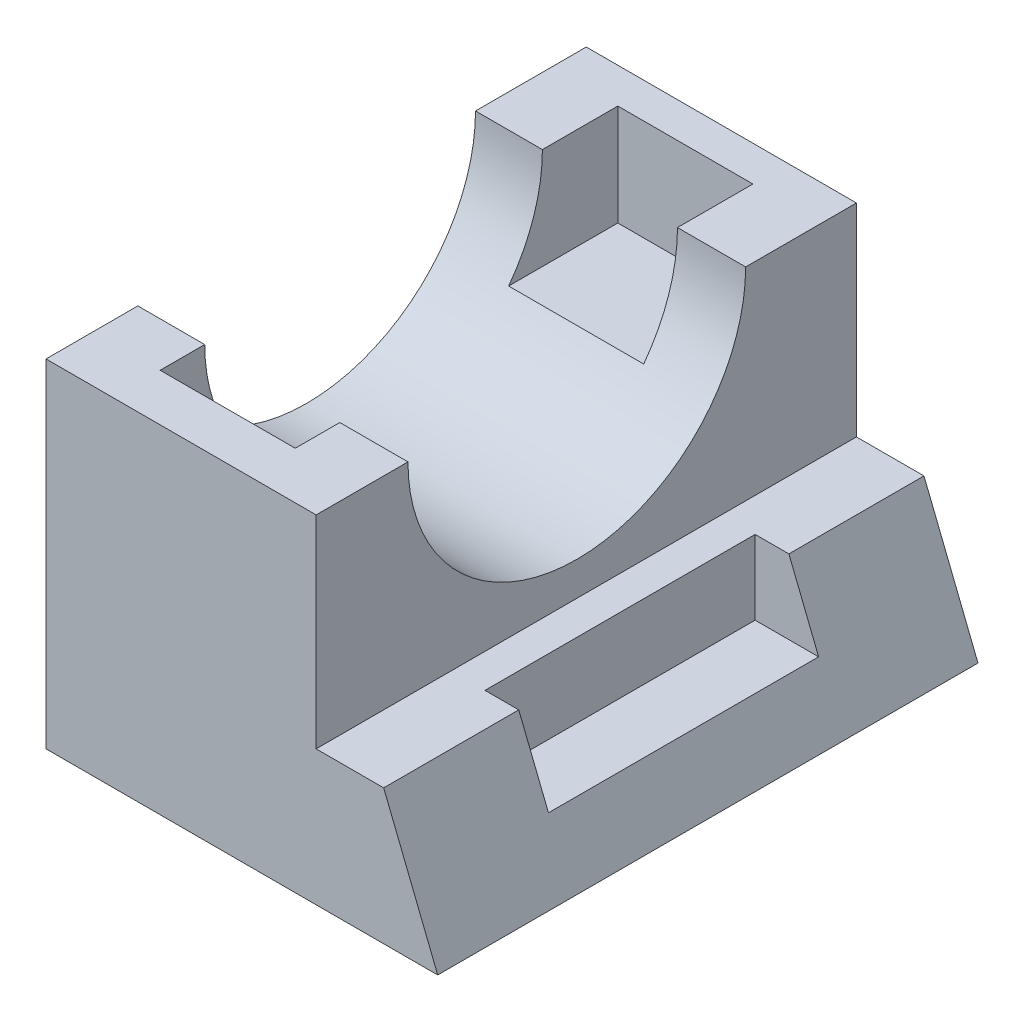
ISO-10303-21;
HEADER;
FILE_DESCRIPTION(('STEP AP214'),'2;1');
FILE_NAME('part.step','',(''),(''),'','','');
FILE_SCHEMA(('AUTOMOTIVE_DESIGN { 1 0 10303 214 1 1 1 1 }'));
ENDSEC;
DATA;
#1=APPLICATION_CONTEXT('core data for automotive mechanical design processes');
#2=APPLICATION_PROTOCOL_DEFINITION('international standard','automotive_design',2000,#1);
#3=PRODUCT_CONTEXT('',#1,'mechanical');
#4=PRODUCT('Part','Part','',(#3));
#5=PRODUCT_RELATED_PRODUCT_CATEGORY('part','',(#4));
#6=PRODUCT_DEFINITION_FORMATION('','',#4);
#7=PRODUCT_DEFINITION_CONTEXT('part definition',#1,'design');
#8=PRODUCT_DEFINITION('design','',#6,#7);
#9=PRODUCT_DEFINITION_SHAPE('','',#8);
#10=(LENGTH_UNIT() NAMED_UNIT(*) SI_UNIT(.MILLI.,.METRE.));
#11=(NAMED_UNIT(*) PLANE_ANGLE_UNIT() SI_UNIT($,.RADIAN.));
#12=(NAMED_UNIT(*) SI_UNIT($,.STERADIAN.) SOLID_ANGLE_UNIT());
#13=UNCERTAINTY_MEASURE_WITH_UNIT(LENGTH_MEASURE(1.E-05),#10,'distance_accuracy_value','');
#14=(GEOMETRIC_REPRESENTATION_CONTEXT(3) GLOBAL_UNCERTAINTY_ASSIGNED_CONTEXT((#13)) GLOBAL_UNIT_ASSIGNED_CONTEXT((#10,
#11,#12)) REPRESENTATION_CONTEXT('',''));
#15=CARTESIAN_POINT('',(0.,0.,0.));
#16=DIRECTION('',(0.,0.,1.));
#17=DIRECTION('',(1.,0.,0.));
#18=AXIS2_PLACEMENT_3D('',#15,#16,#17);
#19=CARTESIAN_POINT('',(40.,50.,80.));
#20=DIRECTION('',(0.,-1.,0.));
#21=DIRECTION('',(0.,0.,-1.));
#22=AXIS2_PLACEMENT_3D('',#19,#20,#21);
#23=PLANE('',#22);
#24=DIRECTION('',(-1.,0.,0.));
#25=VECTOR('',#24,1.);
#26=CARTESIAN_POINT('',(80.,50.,66.4026369118836));
#27=LINE('',#26,#25);
#28=CARTESIAN_POINT('',(40.,50.,66.4026369118836));
#29=VERTEX_POINT('',#28);
#30=CARTESIAN_POINT('',(29.9052649770799,50.,66.4026369118836));
#31=VERTEX_POINT('',#30);
#32=EDGE_CURVE('E272',#29,#31,#27,.T.);
#33=ORIENTED_EDGE('',*,*,#32,.T.);
#34=DIRECTION('',(0.,0.,-1.));
#35=VECTOR('',#34,1.);
#36=CARTESIAN_POINT('',(29.9052649770799,50.,5.23445028715975));
#37=LINE('',#36,#35);
#38=CARTESIAN_POINT('',(29.9052649770799,50.,73.));
#39=VERTEX_POINT('',#38);
#40=EDGE_CURVE('E233',#39,#31,#37,.T.);
#41=ORIENTED_EDGE('',*,*,#40,.F.);
#42=DIRECTION('',(1.,0.,0.));
#43=VECTOR('',#42,1.);
#44=CARTESIAN_POINT('',(29.9052649770799,50.,73.));
#45=LINE('',#44,#43);
#46=CARTESIAN_POINT('',(9.90526497707994,50.,73.));
#47=VERTEX_POINT('',#46);
#48=EDGE_CURVE('E244',#47,#39,#45,.T.);
#49=ORIENTED_EDGE('',*,*,#48,.F.);
#50=DIRECTION('',(0.,0.,1.));
#51=VECTOR('',#50,1.);
#52=CARTESIAN_POINT('',(9.90526497707993,50.,5.23445028715976));
#53=LINE('',#52,#51);
#54=CARTESIAN_POINT('',(9.90526497707994,50.,66.4026369118836));
#55=VERTEX_POINT('',#54);
#56=EDGE_CURVE('E240',#55,#47,#53,.T.);
#57=ORIENTED_EDGE('',*,*,#56,.F.);
#58=CARTESIAN_POINT('',(0.,50.,66.4026369118836));
#59=VERTEX_POINT('',#58);
#60=EDGE_CURVE('E265',#55,#59,#27,.T.);
#61=ORIENTED_EDGE('',*,*,#60,.T.);
#62=DIRECTION('',(0.,0.,-1.));
#63=VECTOR('',#62,1.);
#64=CARTESIAN_POINT('',(0.,50.,80.));
#65=LINE('',#64,#63);
#66=CARTESIAN_POINT('',(0.,50.,80.));
#67=VERTEX_POINT('',#66);
#68=EDGE_CURVE('E338',#67,#59,#65,.T.);
#69=ORIENTED_EDGE('',*,*,#68,.F.);
#70=DIRECTION('',(-1.,0.,0.));
#71=VECTOR('',#70,1.);
#72=CARTESIAN_POINT('',(40.,50.,80.));
#73=LINE('',#72,#71);
#74=CARTESIAN_POINT('',(40.,50.,80.));
#75=VERTEX_POINT('',#74);
#76=EDGE_CURVE('E276',#75,#67,#73,.T.);
#77=ORIENTED_EDGE('',*,*,#76,.F.);
#78=DIRECTION('',(0.,0.,-1.));
#79=VECTOR('',#78,1.);
#80=CARTESIAN_POINT('',(40.,50.,80.));
#81=LINE('',#80,#79);
#82=EDGE_CURVE('E316',#75,#29,#81,.T.);
#83=ORIENTED_EDGE('',*,*,#82,.T.);
#84=EDGE_LOOP('',(#33,#41,#49,#57,#61,#69,#77,#83));
#85=FACE_BOUND('',#84,.T.);
#86=ADVANCED_FACE('F39',(#85),#23,.F.);
#87=DIRECTION('',(-1.,0.,0.));
#88=VECTOR('',#87,1.);
#89=CARTESIAN_POINT('',(29.9052649770799,50.,5.23445028715975));
#90=LINE('',#89,#88);
#91=CARTESIAN_POINT('',(29.9052649770799,50.,5.23445028715975));
#92=VERTEX_POINT('',#91);
#93=CARTESIAN_POINT('',(9.90526497707993,50.,5.23445028715976));
#94=VERTEX_POINT('',#93);
#95=EDGE_CURVE('E236',#92,#94,#90,.T.);
#96=ORIENTED_EDGE('',*,*,#95,.F.);
#97=CARTESIAN_POINT('',(29.9052649770799,50.,16.4026369118836));
#98=VERTEX_POINT('',#97);
#99=EDGE_CURVE('E217',#98,#92,#37,.T.);
#100=ORIENTED_EDGE('',*,*,#99,.F.);
#101=DIRECTION('',(-1.,0.,0.));
#102=VECTOR('',#101,1.);
#103=CARTESIAN_POINT('',(80.,50.,16.4026369118836));
#104=LINE('',#103,#102);
#105=CARTESIAN_POINT('',(40.,50.,16.4026369118836));
#106=VERTEX_POINT('',#105);
#107=EDGE_CURVE('E266',#106,#98,#104,.T.);
#108=ORIENTED_EDGE('',*,*,#107,.F.);
#109=CARTESIAN_POINT('',(40.,50.,0.));
#110=VERTEX_POINT('',#109);
#111=EDGE_CURVE('E296',#106,#110,#81,.T.);
#112=ORIENTED_EDGE('',*,*,#111,.T.);
#113=DIRECTION('',(-1.,0.,0.));
#114=VECTOR('',#113,1.);
#115=CARTESIAN_POINT('',(40.,50.,0.));
#116=LINE('',#115,#114);
#117=CARTESIAN_POINT('',(0.,50.,0.));
#118=VERTEX_POINT('',#117);
#119=EDGE_CURVE('E270',#110,#118,#116,.T.);
#120=ORIENTED_EDGE('',*,*,#119,.T.);
#121=CARTESIAN_POINT('',(0.,50.,16.4026369118836));
#122=VERTEX_POINT('',#121);
#123=EDGE_CURVE('E337',#122,#118,#65,.T.);
#124=ORIENTED_EDGE('',*,*,#123,.F.);
#125=CARTESIAN_POINT('',(9.90526497707993,50.,16.4026369118836));
#126=VERTEX_POINT('',#125);
#127=EDGE_CURVE('E271',#126,#122,#104,.T.);
#128=ORIENTED_EDGE('',*,*,#127,.F.);
#129=EDGE_CURVE('E241',#94,#126,#53,.T.);
#130=ORIENTED_EDGE('',*,*,#129,.F.);
#131=EDGE_LOOP('',(#96,#100,#108,#112,#120,#124,#128,#130));
#132=FACE_BOUND('',#131,.T.);
#133=ADVANCED_FACE('F41',(#132),#23,.F.);
#134=CARTESIAN_POINT('',(0.,50.,80.));
#135=DIRECTION('',(1.,0.,0.));
#136=DIRECTION('',(0.,0.,-1.));
#137=AXIS2_PLACEMENT_3D('',#134,#135,#136);
#138=PLANE('',#137);
#139=ORIENTED_EDGE('',*,*,#68,.T.);
#140=CARTESIAN_POINT('',(0.,50.,41.4026369118836));
#141=DIRECTION('',(-1.,0.,0.));
#142=DIRECTION('',(0.,0.,-1.));
#143=AXIS2_PLACEMENT_3D('',#140,#141,#142);
#144=CIRCLE('',#143,25.);
#145=EDGE_CURVE('E251',#122,#59,#144,.T.);
#146=ORIENTED_EDGE('',*,*,#145,.F.);
#147=ORIENTED_EDGE('',*,*,#123,.T.);
#148=DIRECTION('',(0.,-1.,0.));
#149=VECTOR('',#148,1.);
#150=CARTESIAN_POINT('',(0.,50.,0.));
#151=LINE('',#150,#149);
#152=CARTESIAN_POINT('',(0.,0.,0.));
#153=VERTEX_POINT('',#152);
#154=EDGE_CURVE('E300',#118,#153,#151,.T.);
#155=ORIENTED_EDGE('',*,*,#154,.T.);
#156=DIRECTION('',(0.,0.,-1.));
#157=VECTOR('',#156,1.);
#158=CARTESIAN_POINT('',(0.,0.,80.));
#159=LINE('',#158,#157);
#160=CARTESIAN_POINT('',(0.,0.,80.));
#161=VERTEX_POINT('',#160);
#162=EDGE_CURVE('E333',#161,#153,#159,.T.);
#163=ORIENTED_EDGE('',*,*,#162,.F.);
#164=DIRECTION('',(0.,-1.,0.));
#165=VECTOR('',#164,1.);
#166=CARTESIAN_POINT('',(0.,50.,80.));
#167=LINE('',#166,#165);
#168=EDGE_CURVE('E280',#67,#161,#167,.T.);
#169=ORIENTED_EDGE('',*,*,#168,.F.);
#170=EDGE_LOOP('',(#139,#146,#147,#155,#163,#169));
#171=FACE_BOUND('',#170,.T.);
#172=ADVANCED_FACE('F415',(#171),#138,.F.);
#173=CARTESIAN_POINT('',(0.,0.,80.));
#174=DIRECTION('',(0.,1.,0.));
#175=DIRECTION('',(0.,0.,1.));
#176=AXIS2_PLACEMENT_3D('',#173,#174,#175);
#177=PLANE('',#176);
#178=DIRECTION('',(1.,0.,0.));
#179=VECTOR('',#178,1.);
#180=CARTESIAN_POINT('',(0.,0.,0.));
#181=LINE('',#180,#179);
#182=CARTESIAN_POINT('',(58.,0.,0.));
#183=VERTEX_POINT('',#182);
#184=EDGE_CURVE('E303',#153,#183,#181,.T.);
#185=ORIENTED_EDGE('',*,*,#184,.T.);
#186=DIRECTION('',(0.,0.,-1.));
#187=VECTOR('',#186,1.);
#188=CARTESIAN_POINT('',(58.,0.,80.));
#189=LINE('',#188,#187);
#190=CARTESIAN_POINT('',(58.,0.,80.));
#191=VERTEX_POINT('',#190);
#192=EDGE_CURVE('E329',#191,#183,#189,.T.);
#193=ORIENTED_EDGE('',*,*,#192,.F.);
#194=DIRECTION('',(1.,0.,0.));
#195=VECTOR('',#194,1.);
#196=CARTESIAN_POINT('',(0.,0.,80.));
#197=LINE('',#196,#195);
#198=EDGE_CURVE('E284',#161,#191,#197,.T.);
#199=ORIENTED_EDGE('',*,*,#198,.F.);
#200=ORIENTED_EDGE('',*,*,#162,.T.);
#201=EDGE_LOOP('',(#185,#193,#199,#200));
#202=FACE_BOUND('',#201,.T.);
#203=ADVANCED_FACE('F438',(#202),#177,.F.);
#204=CARTESIAN_POINT('',(58.,0.,80.));
#205=DIRECTION('',(-0.928476690885259,-0.371390676354104,0.));
#206=DIRECTION('',(0.371390676354104,-0.928476690885259,0.));
#207=AXIS2_PLACEMENT_3D('',#204,#205,#206);
#208=PLANE('',#207);
#209=DIRECTION('',(0.,0.,-1.));
#210=VECTOR('',#209,1.);
#211=CARTESIAN_POINT('',(50.,20.,80.));
#212=LINE('',#211,#210);
#213=CARTESIAN_POINT('',(50.,20.,20.));
#214=VERTEX_POINT('',#213);
#215=CARTESIAN_POINT('',(50.,20.,0.));
#216=VERTEX_POINT('',#215);
#217=EDGE_CURVE('E324',#214,#216,#212,.T.);
#218=ORIENTED_EDGE('',*,*,#217,.F.);
#219=DIRECTION('',(0.371390676354104,-0.928476690885259,0.));
#220=VECTOR('',#219,1.);
#221=CARTESIAN_POINT('',(58.,0.,20.));
#222=LINE('',#221,#220);
#223=CARTESIAN_POINT('',(54.4,9.00000000000001,20.));
#224=VERTEX_POINT('',#223);
#225=EDGE_CURVE('E213',#214,#224,#222,.T.);
#226=ORIENTED_EDGE('',*,*,#225,.T.);
#227=DIRECTION('',(0.,0.,-1.));
#228=VECTOR('',#227,1.);
#229=CARTESIAN_POINT('',(54.4,9.00000000000001,80.));
#230=LINE('',#229,#228);
#231=CARTESIAN_POINT('',(54.4,9.00000000000001,60.));
#232=VERTEX_POINT('',#231);
#233=EDGE_CURVE('E11',#232,#224,#230,.T.);
#234=ORIENTED_EDGE('',*,*,#233,.F.);
#235=DIRECTION('',(-0.371390676354104,0.928476690885259,0.));
#236=VECTOR('',#235,1.);
#237=CARTESIAN_POINT('',(58.,0.,60.));
#238=LINE('',#237,#236);
#239=CARTESIAN_POINT('',(50.,20.,60.));
#240=VERTEX_POINT('',#239);
#241=EDGE_CURVE('E191',#232,#240,#238,.T.);
#242=ORIENTED_EDGE('',*,*,#241,.T.);
#243=CARTESIAN_POINT('',(50.,20.,80.));
#244=VERTEX_POINT('',#243);
#245=EDGE_CURVE('E325',#244,#240,#212,.T.);
#246=ORIENTED_EDGE('',*,*,#245,.F.);
#247=DIRECTION('',(-0.371390676354104,0.928476690885259,0.));
#248=VECTOR('',#247,1.);
#249=CARTESIAN_POINT('',(58.,0.,80.));
#250=LINE('',#249,#248);
#251=EDGE_CURVE('E287',#191,#244,#250,.T.);
#252=ORIENTED_EDGE('',*,*,#251,.F.);
#253=ORIENTED_EDGE('',*,*,#192,.T.);
#254=DIRECTION('',(-0.371390676354104,0.928476690885259,0.));
#255=VECTOR('',#254,1.);
#256=CARTESIAN_POINT('',(58.,0.,0.));
#257=LINE('',#256,#255);
#258=EDGE_CURVE('E306',#183,#216,#257,.T.);
#259=ORIENTED_EDGE('',*,*,#258,.T.);
#260=EDGE_LOOP('',(#218,#226,#234,#242,#246,#252,#253,#259));
#261=FACE_BOUND('',#260,.T.);
#262=ADVANCED_FACE('F432',(#261),#208,.F.);
#263=CARTESIAN_POINT('',(50.,20.,80.));
#264=DIRECTION('',(0.,-1.,0.));
#265=DIRECTION('',(0.,0.,-1.));
#266=AXIS2_PLACEMENT_3D('',#263,#264,#265);
#267=PLANE('',#266);
#268=DIRECTION('',(0.,0.,1.));
#269=VECTOR('',#268,1.);
#270=CARTESIAN_POINT('',(45.,20.,20.));
#271=LINE('',#270,#269);
#272=CARTESIAN_POINT('',(45.,20.,20.));
#273=VERTEX_POINT('',#272);
#274=CARTESIAN_POINT('',(45.,20.,60.));
#275=VERTEX_POINT('',#274);
#276=EDGE_CURVE('E55',#273,#275,#271,.T.);
#277=ORIENTED_EDGE('',*,*,#276,.F.);
#278=DIRECTION('',(1.,0.,0.));
#279=VECTOR('',#278,1.);
#280=CARTESIAN_POINT('',(50.,20.,20.));
#281=LINE('',#280,#279);
#282=EDGE_CURVE('E48',#273,#214,#281,.T.);
#283=ORIENTED_EDGE('',*,*,#282,.T.);
#284=ORIENTED_EDGE('',*,*,#217,.T.);
#285=DIRECTION('',(-1.,0.,0.));
#286=VECTOR('',#285,1.);
#287=CARTESIAN_POINT('',(50.,20.,0.));
#288=LINE('',#287,#286);
#289=CARTESIAN_POINT('',(40.,20.,0.));
#290=VERTEX_POINT('',#289);
#291=EDGE_CURVE('E310',#216,#290,#288,.T.);
#292=ORIENTED_EDGE('',*,*,#291,.T.);
#293=DIRECTION('',(0.,0.,-1.));
#294=VECTOR('',#293,1.);
#295=CARTESIAN_POINT('',(40.,20.,80.));
#296=LINE('',#295,#294);
#297=CARTESIAN_POINT('',(40.,20.,80.));
#298=VERTEX_POINT('',#297);
#299=EDGE_CURVE('E320',#298,#290,#296,.T.);
#300=ORIENTED_EDGE('',*,*,#299,.F.);
#301=DIRECTION('',(-1.,0.,0.));
#302=VECTOR('',#301,1.);
#303=CARTESIAN_POINT('',(50.,20.,80.));
#304=LINE('',#303,#302);
#305=EDGE_CURVE('E290',#244,#298,#304,.T.);
#306=ORIENTED_EDGE('',*,*,#305,.F.);
#307=ORIENTED_EDGE('',*,*,#245,.T.);
#308=DIRECTION('',(1.,0.,0.));
#309=VECTOR('',#308,1.);
#310=CARTESIAN_POINT('',(45.,20.,60.));
#311=LINE('',#310,#309);
#312=EDGE_CURVE('E200',#275,#240,#311,.T.);
#313=ORIENTED_EDGE('',*,*,#312,.F.);
#314=EDGE_LOOP('',(#277,#283,#284,#292,#300,#306,#307,#313));
#315=FACE_BOUND('',#314,.T.);
#316=ADVANCED_FACE('F429',(#315),#267,.F.);
#317=CARTESIAN_POINT('',(40.,20.,80.));
#318=DIRECTION('',(-1.,0.,0.));
#319=DIRECTION('',(0.,0.,1.));
#320=AXIS2_PLACEMENT_3D('',#317,#318,#319);
#321=PLANE('',#320);
#322=ORIENTED_EDGE('',*,*,#111,.F.);
#323=CARTESIAN_POINT('',(40.,50.,41.4026369118836));
#324=DIRECTION('',(-1.,0.,0.));
#325=DIRECTION('',(0.,0.,1.));
#326=AXIS2_PLACEMENT_3D('',#323,#324,#325);
#327=CIRCLE('',#326,25.);
#328=EDGE_CURVE('E342',#106,#29,#327,.T.);
#329=ORIENTED_EDGE('',*,*,#328,.T.);
#330=ORIENTED_EDGE('',*,*,#82,.F.);
#331=DIRECTION('',(0.,1.,0.));
#332=VECTOR('',#331,1.);
#333=CARTESIAN_POINT('',(40.,20.,80.));
#334=LINE('',#333,#332);
#335=EDGE_CURVE('E293',#298,#75,#334,.T.);
#336=ORIENTED_EDGE('',*,*,#335,.F.);
#337=ORIENTED_EDGE('',*,*,#299,.T.);
#338=DIRECTION('',(0.,1.,0.));
#339=VECTOR('',#338,1.);
#340=CARTESIAN_POINT('',(40.,20.,0.));
#341=LINE('',#340,#339);
#342=EDGE_CURVE('E281',#290,#110,#341,.T.);
#343=ORIENTED_EDGE('',*,*,#342,.T.);
#344=EDGE_LOOP('',(#322,#329,#330,#336,#337,#343));
#345=FACE_BOUND('',#344,.T.);
#346=ADVANCED_FACE('F425',(#345),#321,.F.);
#347=CARTESIAN_POINT('',(0.,0.,80.));
#348=DIRECTION('',(0.,0.,1.));
#349=DIRECTION('',(1.,0.,0.));
#350=AXIS2_PLACEMENT_3D('',#347,#348,#349);
#351=PLANE('',#350);
#352=ORIENTED_EDGE('',*,*,#76,.T.);
#353=ORIENTED_EDGE('',*,*,#168,.T.);
#354=ORIENTED_EDGE('',*,*,#198,.T.);
#355=ORIENTED_EDGE('',*,*,#251,.T.);
#356=ORIENTED_EDGE('',*,*,#305,.T.);
#357=ORIENTED_EDGE('',*,*,#335,.T.);
#358=EDGE_LOOP('',(#352,#353,#354,#355,#356,#357));
#359=FACE_BOUND('',#358,.T.);
#360=ADVANCED_FACE('F441',(#359),#351,.T.);
#361=CARTESIAN_POINT('',(0.,0.,0.));
#362=DIRECTION('',(0.,0.,1.));
#363=DIRECTION('',(1.,0.,0.));
#364=AXIS2_PLACEMENT_3D('',#361,#362,#363);
#365=PLANE('',#364);
#366=ORIENTED_EDGE('',*,*,#119,.F.);
#367=ORIENTED_EDGE('',*,*,#342,.F.);
#368=ORIENTED_EDGE('',*,*,#291,.F.);
#369=ORIENTED_EDGE('',*,*,#258,.F.);
#370=ORIENTED_EDGE('',*,*,#184,.F.);
#371=ORIENTED_EDGE('',*,*,#154,.F.);
#372=EDGE_LOOP('',(#366,#367,#368,#369,#370,#371));
#373=FACE_BOUND('',#372,.T.);
#374=ADVANCED_FACE('F420',(#373),#365,.F.);
#375=CARTESIAN_POINT('',(80.,50.,41.4026369118836));
#376=DIRECTION('',(-1.,0.,0.));
#377=DIRECTION('',(0.,0.,1.));
#378=AXIS2_PLACEMENT_3D('',#375,#376,#377);
#379=CYLINDRICAL_SURFACE('',#378,25.);
#380=DIRECTION('',(-1.,0.,0.));
#381=VECTOR('',#380,1.);
#382=CARTESIAN_POINT('',(80.,35.,61.4026369118836));
#383=LINE('',#382,#381);
#384=CARTESIAN_POINT('',(9.90526497707994,35.,61.4026369118836));
#385=VERTEX_POINT('',#384);
#386=CARTESIAN_POINT('',(29.9052649770799,35.,61.4026369118836));
#387=VERTEX_POINT('',#386);
#388=EDGE_CURVE('E359',#385,#387,#383,.F.);
#389=ORIENTED_EDGE('',*,*,#388,.T.);
#390=CARTESIAN_POINT('',(29.9052649770799,50.,41.4026369118836));
#391=DIRECTION('',(1.,0.,0.));
#392=DIRECTION('',(0.,0.,-1.));
#393=AXIS2_PLACEMENT_3D('',#390,#391,#392);
#394=CIRCLE('',#393,25.);
#395=EDGE_CURVE('E360',#387,#31,#394,.F.);
#396=ORIENTED_EDGE('',*,*,#395,.T.);
#397=ORIENTED_EDGE('',*,*,#32,.F.);
#398=ORIENTED_EDGE('',*,*,#328,.F.);
#399=ORIENTED_EDGE('',*,*,#107,.T.);
#400=CARTESIAN_POINT('',(29.9052649770799,35.,21.4026369118836));
#401=VERTEX_POINT('',#400);
#402=EDGE_CURVE('E354',#98,#401,#394,.F.);
#403=ORIENTED_EDGE('',*,*,#402,.T.);
#404=DIRECTION('',(-1.,0.,0.));
#405=VECTOR('',#404,1.);
#406=CARTESIAN_POINT('',(80.,35.,21.4026369118836));
#407=LINE('',#406,#405);
#408=CARTESIAN_POINT('',(9.90526497707993,35.,21.4026369118836));
#409=VERTEX_POINT('',#408);
#410=EDGE_CURVE('E346',#401,#409,#407,.T.);
#411=ORIENTED_EDGE('',*,*,#410,.T.);
#412=CARTESIAN_POINT('',(9.90526497707993,50.,41.4026369118836));
#413=DIRECTION('',(-1.,0.,0.));
#414=DIRECTION('',(0.,0.,1.));
#415=AXIS2_PLACEMENT_3D('',#412,#413,#414);
#416=CIRCLE('',#415,25.);
#417=EDGE_CURVE('E350',#409,#126,#416,.F.);
#418=ORIENTED_EDGE('',*,*,#417,.T.);
#419=ORIENTED_EDGE('',*,*,#127,.T.);
#420=ORIENTED_EDGE('',*,*,#145,.T.);
#421=ORIENTED_EDGE('',*,*,#60,.F.);
#422=EDGE_CURVE('E355',#55,#385,#416,.F.);
#423=ORIENTED_EDGE('',*,*,#422,.T.);
#424=EDGE_LOOP('',(#389,#396,#397,#398,#399,#403,#411,#418,#419,#420,#421,#423));
#425=FACE_BOUND('',#424,.T.);
#426=ADVANCED_FACE('F373',(#425),#379,.F.);
#427=CARTESIAN_POINT('',(0.,35.,0.));
#428=DIRECTION('',(0.,-1.,0.));
#429=DIRECTION('',(0.,0.,-1.));
#430=AXIS2_PLACEMENT_3D('',#427,#428,#429);
#431=PLANE('',#430);
#432=DIRECTION('',(0.,0.,-1.));
#433=VECTOR('',#432,1.);
#434=CARTESIAN_POINT('',(29.9052649770799,35.,5.23445028715975));
#435=LINE('',#434,#433);
#436=CARTESIAN_POINT('',(29.9052649770799,35.,5.23445028715975));
#437=VERTEX_POINT('',#436);
#438=EDGE_CURVE('E221',#401,#437,#435,.T.);
#439=ORIENTED_EDGE('',*,*,#438,.T.);
#440=DIRECTION('',(-1.,0.,0.));
#441=VECTOR('',#440,1.);
#442=CARTESIAN_POINT('',(29.9052649770799,35.,5.23445028715975));
#443=LINE('',#442,#441);
#444=CARTESIAN_POINT('',(9.90526497707993,35.,5.23445028715976));
#445=VERTEX_POINT('',#444);
#446=EDGE_CURVE('E220',#437,#445,#443,.T.);
#447=ORIENTED_EDGE('',*,*,#446,.T.);
#448=DIRECTION('',(0.,0.,1.));
#449=VECTOR('',#448,1.);
#450=CARTESIAN_POINT('',(9.90526497707993,35.,5.23445028715976));
#451=LINE('',#450,#449);
#452=EDGE_CURVE('E226',#445,#409,#451,.T.);
#453=ORIENTED_EDGE('',*,*,#452,.T.);
#454=ORIENTED_EDGE('',*,*,#410,.F.);
#455=EDGE_LOOP('',(#439,#447,#453,#454));
#456=FACE_BOUND('',#455,.T.);
#457=ADVANCED_FACE('F405',(#456),#431,.F.);
#458=CARTESIAN_POINT('',(9.90526497707993,35.,5.23445028715976));
#459=DIRECTION('',(-1.,0.,0.));
#460=DIRECTION('',(0.,0.,1.));
#461=AXIS2_PLACEMENT_3D('',#458,#459,#460);
#462=PLANE('',#461);
#463=ORIENTED_EDGE('',*,*,#452,.F.);
#464=DIRECTION('',(0.,1.,0.));
#465=VECTOR('',#464,1.);
#466=CARTESIAN_POINT('',(9.90526497707993,35.,5.23445028715976));
#467=LINE('',#466,#465);
#468=EDGE_CURVE('E256',#445,#94,#467,.T.);
#469=ORIENTED_EDGE('',*,*,#468,.T.);
#470=ORIENTED_EDGE('',*,*,#129,.T.);
#471=ORIENTED_EDGE('',*,*,#417,.F.);
#472=EDGE_LOOP('',(#463,#469,#470,#471));
#473=FACE_BOUND('',#472,.T.);
#474=ADVANCED_FACE('F402',(#473),#462,.F.);
#475=CARTESIAN_POINT('',(29.9052649770799,35.,5.23445028715975));
#476=DIRECTION('',(1.,0.,0.));
#477=DIRECTION('',(0.,0.,-1.));
#478=AXIS2_PLACEMENT_3D('',#475,#476,#477);
#479=PLANE('',#478);
#480=ORIENTED_EDGE('',*,*,#99,.T.);
#481=DIRECTION('',(0.,1.,0.));
#482=VECTOR('',#481,1.);
#483=CARTESIAN_POINT('',(29.9052649770799,35.,5.23445028715975));
#484=LINE('',#483,#482);
#485=EDGE_CURVE('E232',#437,#92,#484,.T.);
#486=ORIENTED_EDGE('',*,*,#485,.F.);
#487=ORIENTED_EDGE('',*,*,#438,.F.);
#488=ORIENTED_EDGE('',*,*,#402,.F.);
#489=EDGE_LOOP('',(#480,#486,#487,#488));
#490=FACE_BOUND('',#489,.T.);
#491=ADVANCED_FACE('F388',(#490),#479,.F.);
#492=CARTESIAN_POINT('',(29.9052649770799,35.,5.23445028715975));
#493=DIRECTION('',(0.,0.,-1.));
#494=DIRECTION('',(-1.,0.,0.));
#495=AXIS2_PLACEMENT_3D('',#492,#493,#494);
#496=PLANE('',#495);
#497=ORIENTED_EDGE('',*,*,#95,.T.);
#498=ORIENTED_EDGE('',*,*,#468,.F.);
#499=ORIENTED_EDGE('',*,*,#446,.F.);
#500=ORIENTED_EDGE('',*,*,#485,.T.);
#501=EDGE_LOOP('',(#497,#498,#499,#500));
#502=FACE_BOUND('',#501,.T.);
#503=ADVANCED_FACE('F395',(#502),#496,.F.);
#504=CARTESIAN_POINT('',(29.9052649770799,35.,73.));
#505=VERTEX_POINT('',#504);
#506=EDGE_CURVE('E63',#505,#387,#435,.T.);
#507=ORIENTED_EDGE('',*,*,#506,.F.);
#508=DIRECTION('',(0.,1.,0.));
#509=VECTOR('',#508,1.);
#510=CARTESIAN_POINT('',(29.9052649770799,35.,73.));
#511=LINE('',#510,#509);
#512=EDGE_CURVE('E248',#505,#39,#511,.T.);
#513=ORIENTED_EDGE('',*,*,#512,.T.);
#514=ORIENTED_EDGE('',*,*,#40,.T.);
#515=ORIENTED_EDGE('',*,*,#395,.F.);
#516=EDGE_LOOP('',(#507,#513,#514,#515));
#517=FACE_BOUND('',#516,.T.);
#518=ADVANCED_FACE('F444',(#517),#479,.F.);
#519=ORIENTED_EDGE('',*,*,#56,.T.);
#520=DIRECTION('',(0.,1.,0.));
#521=VECTOR('',#520,1.);
#522=CARTESIAN_POINT('',(9.90526497707994,35.,73.));
#523=LINE('',#522,#521);
#524=CARTESIAN_POINT('',(9.90526497707994,35.,73.));
#525=VERTEX_POINT('',#524);
#526=EDGE_CURVE('E252',#525,#47,#523,.T.);
#527=ORIENTED_EDGE('',*,*,#526,.F.);
#528=EDGE_CURVE('E225',#385,#525,#451,.T.);
#529=ORIENTED_EDGE('',*,*,#528,.F.);
#530=ORIENTED_EDGE('',*,*,#422,.F.);
#531=EDGE_LOOP('',(#519,#527,#529,#530));
#532=FACE_BOUND('',#531,.T.);
#533=ADVANCED_FACE('F377',(#532),#462,.F.);
#534=ORIENTED_EDGE('',*,*,#528,.T.);
#535=DIRECTION('',(1.,0.,0.));
#536=VECTOR('',#535,1.);
#537=CARTESIAN_POINT('',(29.9052649770799,35.,73.));
#538=LINE('',#537,#536);
#539=EDGE_CURVE('E229',#525,#505,#538,.T.);
#540=ORIENTED_EDGE('',*,*,#539,.T.);
#541=ORIENTED_EDGE('',*,*,#506,.T.);
#542=ORIENTED_EDGE('',*,*,#388,.F.);
#543=EDGE_LOOP('',(#534,#540,#541,#542));
#544=FACE_BOUND('',#543,.T.);
#545=ADVANCED_FACE('F448',(#544),#431,.F.);
#546=CARTESIAN_POINT('',(29.9052649770799,35.,73.));
#547=DIRECTION('',(0.,0.,1.));
#548=DIRECTION('',(1.,0.,0.));
#549=AXIS2_PLACEMENT_3D('',#546,#547,#548);
#550=PLANE('',#549);
#551=ORIENTED_EDGE('',*,*,#48,.T.);
#552=ORIENTED_EDGE('',*,*,#512,.F.);
#553=ORIENTED_EDGE('',*,*,#539,.F.);
#554=ORIENTED_EDGE('',*,*,#526,.T.);
#555=EDGE_LOOP('',(#551,#552,#553,#554));
#556=FACE_BOUND('',#555,.T.);
#557=ADVANCED_FACE('F447',(#556),#550,.F.);
#558=CARTESIAN_POINT('',(0.,9.00000000000001,0.));
#559=DIRECTION('',(0.,1.,0.));
#560=DIRECTION('',(0.,0.,1.));
#561=AXIS2_PLACEMENT_3D('',#558,#559,#560);
#562=PLANE('',#561);
#563=ORIENTED_EDGE('',*,*,#233,.T.);
#564=DIRECTION('',(-1.,0.,0.));
#565=VECTOR('',#564,1.);
#566=CARTESIAN_POINT('',(45.,9.00000000000001,20.));
#567=LINE('',#566,#565);
#568=CARTESIAN_POINT('',(45.,9.00000000000001,20.));
#569=VERTEX_POINT('',#568);
#570=EDGE_CURVE('E185',#224,#569,#567,.T.);
#571=ORIENTED_EDGE('',*,*,#570,.T.);
#572=DIRECTION('',(0.,0.,1.));
#573=VECTOR('',#572,1.);
#574=CARTESIAN_POINT('',(45.,9.00000000000001,20.));
#575=LINE('',#574,#573);
#576=CARTESIAN_POINT('',(45.,9.00000000000001,60.));
#577=VERTEX_POINT('',#576);
#578=EDGE_CURVE('E180',#569,#577,#575,.T.);
#579=ORIENTED_EDGE('',*,*,#578,.T.);
#580=DIRECTION('',(1.,0.,0.));
#581=VECTOR('',#580,1.);
#582=CARTESIAN_POINT('',(45.,9.00000000000001,60.));
#583=LINE('',#582,#581);
#584=EDGE_CURVE('E188',#577,#232,#583,.T.);
#585=ORIENTED_EDGE('',*,*,#584,.T.);
#586=EDGE_LOOP('',(#563,#571,#579,#585));
#587=FACE_BOUND('',#586,.T.);
#588=ADVANCED_FACE('F196',(#587),#562,.T.);
#589=CARTESIAN_POINT('',(45.,9.00000000000001,20.));
#590=DIRECTION('',(0.,0.,-1.));
#591=DIRECTION('',(-1.,0.,0.));
#592=AXIS2_PLACEMENT_3D('',#589,#590,#591);
#593=PLANE('',#592);
#594=ORIENTED_EDGE('',*,*,#282,.F.);
#595=DIRECTION('',(0.,1.,0.));
#596=VECTOR('',#595,1.);
#597=CARTESIAN_POINT('',(45.,9.00000000000001,20.));
#598=LINE('',#597,#596);
#599=EDGE_CURVE('E184',#569,#273,#598,.T.);
#600=ORIENTED_EDGE('',*,*,#599,.F.);
#601=ORIENTED_EDGE('',*,*,#570,.F.);
#602=ORIENTED_EDGE('',*,*,#225,.F.);
#603=EDGE_LOOP('',(#594,#600,#601,#602));
#604=FACE_BOUND('',#603,.T.);
#605=ADVANCED_FACE('F528',(#604),#593,.F.);
#606=CARTESIAN_POINT('',(45.,9.00000000000001,60.));
#607=DIRECTION('',(0.,0.,1.));
#608=DIRECTION('',(1.,0.,0.));
#609=AXIS2_PLACEMENT_3D('',#606,#607,#608);
#610=PLANE('',#609);
#611=ORIENTED_EDGE('',*,*,#584,.F.);
#612=DIRECTION('',(0.,1.,0.));
#613=VECTOR('',#612,1.);
#614=CARTESIAN_POINT('',(45.,9.00000000000001,60.));
#615=LINE('',#614,#613);
#616=EDGE_CURVE('E176',#577,#275,#615,.T.);
#617=ORIENTED_EDGE('',*,*,#616,.T.);
#618=ORIENTED_EDGE('',*,*,#312,.T.);
#619=ORIENTED_EDGE('',*,*,#241,.F.);
#620=EDGE_LOOP('',(#611,#617,#618,#619));
#621=FACE_BOUND('',#620,.T.);
#622=ADVANCED_FACE('F189',(#621),#610,.F.);
#623=CARTESIAN_POINT('',(45.,9.00000000000001,20.));
#624=DIRECTION('',(-1.,0.,0.));
#625=DIRECTION('',(0.,0.,1.));
#626=AXIS2_PLACEMENT_3D('',#623,#624,#625);
#627=PLANE('',#626);
#628=ORIENTED_EDGE('',*,*,#276,.T.);
#629=ORIENTED_EDGE('',*,*,#616,.F.);
#630=ORIENTED_EDGE('',*,*,#578,.F.);
#631=ORIENTED_EDGE('',*,*,#599,.T.);
#632=EDGE_LOOP('',(#628,#629,#630,#631));
#633=FACE_BOUND('',#632,.T.);
#634=ADVANCED_FACE('F178',(#633),#627,.F.);
#635=CLOSED_SHELL('',(#86,#133,#172,#203,#262,#316,#346,#360,#374,#426,#457,#474,#491,#503,#518,
#533,#545,#557,#588,#605,#622,#634));
#636=MANIFOLD_SOLID_BREP('B2',#635);
#637=ADVANCED_BREP_SHAPE_REPRESENTATION('',(#18,#636),#14);
#638=SHAPE_DEFINITION_REPRESENTATION(#9,#637);
ENDSEC;
END-ISO-10303-21;
